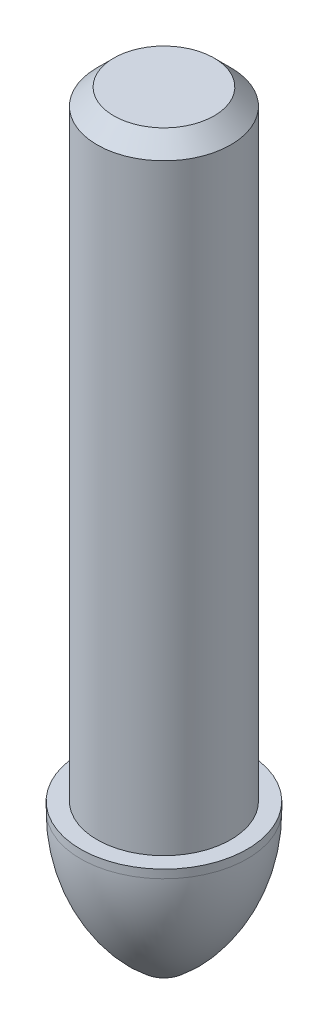
ISO-10303-21;
HEADER;
FILE_DESCRIPTION(('STEP AP214'),'2;1');
FILE_NAME('part.step','',(''),(''),'','','');
FILE_SCHEMA(('AUTOMOTIVE_DESIGN { 1 0 10303 214 1 1 1 1 }'));
ENDSEC;
DATA;
#1=APPLICATION_CONTEXT('core data for automotive mechanical design processes');
#2=APPLICATION_PROTOCOL_DEFINITION('international standard','automotive_design',2000,#1);
#3=PRODUCT_CONTEXT('',#1,'mechanical');
#4=PRODUCT('Part','Part','',(#3));
#5=PRODUCT_RELATED_PRODUCT_CATEGORY('part','',(#4));
#6=PRODUCT_DEFINITION_FORMATION('','',#4);
#7=PRODUCT_DEFINITION_CONTEXT('part definition',#1,'design');
#8=PRODUCT_DEFINITION('design','',#6,#7);
#9=PRODUCT_DEFINITION_SHAPE('','',#8);
#10=(LENGTH_UNIT() NAMED_UNIT(*) SI_UNIT(.MILLI.,.METRE.));
#11=(NAMED_UNIT(*) PLANE_ANGLE_UNIT() SI_UNIT($,.RADIAN.));
#12=(NAMED_UNIT(*) SI_UNIT($,.STERADIAN.) SOLID_ANGLE_UNIT());
#13=UNCERTAINTY_MEASURE_WITH_UNIT(LENGTH_MEASURE(1.E-05),#10,'distance_accuracy_value','');
#14=(GEOMETRIC_REPRESENTATION_CONTEXT(3) GLOBAL_UNCERTAINTY_ASSIGNED_CONTEXT((#13)) GLOBAL_UNIT_ASSIGNED_CONTEXT((#10,
#11,#12)) REPRESENTATION_CONTEXT('',''));
#15=CARTESIAN_POINT('',(0.,0.,0.));
#16=DIRECTION('',(0.,0.,1.));
#17=DIRECTION('',(1.,0.,0.));
#18=AXIS2_PLACEMENT_3D('',#15,#16,#17);
#19=CARTESIAN_POINT('',(0.,-43.7185749975376,0.));
#20=DIRECTION('',(0.,1.,0.));
#21=DIRECTION('',(-1.,0.,0.));
#22=AXIS2_PLACEMENT_3D('',#19,#20,#21);
#23=SPHERICAL_SURFACE('',#22,2.);
#24=CARTESIAN_POINT('',(0.,-45.2790706054517,0.));
#25=DIRECTION('',(0.,1.,0.));
#26=DIRECTION('',(-1.,0.,0.));
#27=AXIS2_PLACEMENT_3D('',#24,#25,#26);
#28=CIRCLE('',#27,1.25094102885822);
#29=CARTESIAN_POINT('',(-1.25094102885821,-45.2790706054517,0.));
#30=VERTEX_POINT('',#29);
#31=EDGE_CURVE('E61',#30,#30,#28,.T.);
#32=ORIENTED_EDGE('',*,*,#31,.F.);
#33=EDGE_LOOP('',(#32));
#34=FACE_BOUND('',#33,.T.);
#35=ADVANCED_FACE('F49',(#34),#23,.T.);
#36=CARTESIAN_POINT('',(0.,-37.5,0.));
#37=DIRECTION('',(0.,1.,0.));
#38=DIRECTION('',(-1.,0.,0.));
#39=AXIS2_PLACEMENT_3D('',#36,#37,#38);
#40=DEGENERATE_TOROIDAL_SURFACE('',#39,4.985,9.97,.F.);
#41=CARTESIAN_POINT('',(0.,-37.5,0.));
#42=DIRECTION('',(0.,1.,0.));
#43=DIRECTION('',(-1.,0.,0.));
#44=AXIS2_PLACEMENT_3D('',#41,#42,#43);
#45=CIRCLE('',#44,4.985);
#46=CARTESIAN_POINT('',(-4.985,-37.5,0.));
#47=VERTEX_POINT('',#46);
#48=EDGE_CURVE('E65',#47,#47,#45,.T.);
#49=ORIENTED_EDGE('',*,*,#48,.F.);
#50=EDGE_LOOP('',(#49));
#51=FACE_BOUND('',#50,.T.);
#52=ORIENTED_EDGE('',*,*,#31,.T.);
#53=EDGE_LOOP('',(#52));
#54=FACE_BOUND('',#53,.T.);
#55=ADVANCED_FACE('F88',(#51,#54),#40,.F.);
#56=CARTESIAN_POINT('',(0.,0.,0.));
#57=DIRECTION('',(0.,1.,0.));
#58=DIRECTION('',(-1.,0.,0.));
#59=AXIS2_PLACEMENT_3D('',#56,#57,#58);
#60=CYLINDRICAL_SURFACE('',#59,4.985);
#61=CARTESIAN_POINT('',(0.,-37.,0.));
#62=DIRECTION('',(0.,1.,0.));
#63=DIRECTION('',(-1.,0.,0.));
#64=AXIS2_PLACEMENT_3D('',#61,#62,#63);
#65=CIRCLE('',#64,4.985);
#66=CARTESIAN_POINT('',(-4.985,-37.,0.));
#67=VERTEX_POINT('',#66);
#68=EDGE_CURVE('E70',#67,#67,#65,.T.);
#69=ORIENTED_EDGE('',*,*,#68,.F.);
#70=EDGE_LOOP('',(#69));
#71=FACE_BOUND('',#70,.T.);
#72=ORIENTED_EDGE('',*,*,#48,.T.);
#73=EDGE_LOOP('',(#72));
#74=FACE_BOUND('',#73,.T.);
#75=ADVANCED_FACE('F82',(#71,#74),#60,.T.);
#76=CARTESIAN_POINT('',(4.,-37.,0.));
#77=DIRECTION('',(0.,-1.,0.));
#78=DIRECTION('',(1.,0.,0.));
#79=AXIS2_PLACEMENT_3D('',#76,#77,#78);
#80=PLANE('',#79);
#81=CARTESIAN_POINT('',(0.,-37.,0.));
#82=DIRECTION('',(0.,1.,0.));
#83=DIRECTION('',(-1.,0.,0.));
#84=AXIS2_PLACEMENT_3D('',#81,#82,#83);
#85=CIRCLE('',#84,4.);
#86=CARTESIAN_POINT('',(-4.,-37.,0.));
#87=VERTEX_POINT('',#86);
#88=EDGE_CURVE('E73',#87,#87,#85,.T.);
#89=ORIENTED_EDGE('',*,*,#88,.F.);
#90=EDGE_LOOP('',(#89));
#91=FACE_BOUND('',#90,.T.);
#92=ORIENTED_EDGE('',*,*,#68,.T.);
#93=EDGE_LOOP('',(#92));
#94=FACE_BOUND('',#93,.T.);
#95=ADVANCED_FACE('F79',(#91,#94),#80,.F.);
#96=CARTESIAN_POINT('',(0.,0.,0.));
#97=DIRECTION('',(0.,1.,0.));
#98=DIRECTION('',(-1.,0.,0.));
#99=AXIS2_PLACEMENT_3D('',#96,#97,#98);
#100=CYLINDRICAL_SURFACE('',#99,4.);
#101=CARTESIAN_POINT('',(0.,-0.999999999999998,0.));
#102=DIRECTION('',(0.,-1.,0.));
#103=DIRECTION('',(1.,0.,0.));
#104=AXIS2_PLACEMENT_3D('',#101,#102,#103);
#105=CIRCLE('',#104,4.);
#106=CARTESIAN_POINT('',(4.,-0.999999999999998,0.));
#107=VERTEX_POINT('',#106);
#108=EDGE_CURVE('E10',#107,#107,#105,.T.);
#109=ORIENTED_EDGE('',*,*,#108,.T.);
#110=EDGE_LOOP('',(#109));
#111=FACE_BOUND('',#110,.T.);
#112=ORIENTED_EDGE('',*,*,#88,.T.);
#113=EDGE_LOOP('',(#112));
#114=FACE_BOUND('',#113,.T.);
#115=ADVANCED_FACE('F77',(#111,#114),#100,.T.);
#116=CARTESIAN_POINT('',(0.,0.,0.));
#117=DIRECTION('',(0.,-1.,0.));
#118=DIRECTION('',(1.,0.,0.));
#119=AXIS2_PLACEMENT_3D('',#116,#117,#118);
#120=PLANE('',#119);
#121=CARTESIAN_POINT('',(0.,0.,0.));
#122=DIRECTION('',(0.,-1.,0.));
#123=DIRECTION('',(1.,0.,0.));
#124=AXIS2_PLACEMENT_3D('',#121,#122,#123);
#125=CIRCLE('',#124,3.);
#126=CARTESIAN_POINT('',(3.,0.,0.));
#127=VERTEX_POINT('',#126);
#128=EDGE_CURVE('E57',#127,#127,#125,.F.);
#129=ORIENTED_EDGE('',*,*,#128,.T.);
#130=EDGE_LOOP('',(#129));
#131=FACE_BOUND('',#130,.T.);
#132=ADVANCED_FACE('F103',(#131),#120,.F.);
#133=CARTESIAN_POINT('',(0.,0.,0.));
#134=DIRECTION('',(0.,-1.,0.));
#135=DIRECTION('',(1.,0.,0.));
#136=AXIS2_PLACEMENT_3D('',#133,#134,#135);
#137=CONICAL_SURFACE('',#136,3.,0.785398163397448);
#138=ORIENTED_EDGE('',*,*,#108,.F.);
#139=EDGE_LOOP('',(#138));
#140=FACE_BOUND('',#139,.T.);
#141=ORIENTED_EDGE('',*,*,#128,.F.);
#142=EDGE_LOOP('',(#141));
#143=FACE_BOUND('',#142,.T.);
#144=ADVANCED_FACE('F52',(#140,#143),#137,.T.);
#145=CLOSED_SHELL('',(#35,#55,#75,#95,#115,#132,#144));
#146=MANIFOLD_SOLID_BREP('B2',#145);
#147=ADVANCED_BREP_SHAPE_REPRESENTATION('',(#18,#146),#14);
#148=SHAPE_DEFINITION_REPRESENTATION(#9,#147);
ENDSEC;
END-ISO-10303-21;
